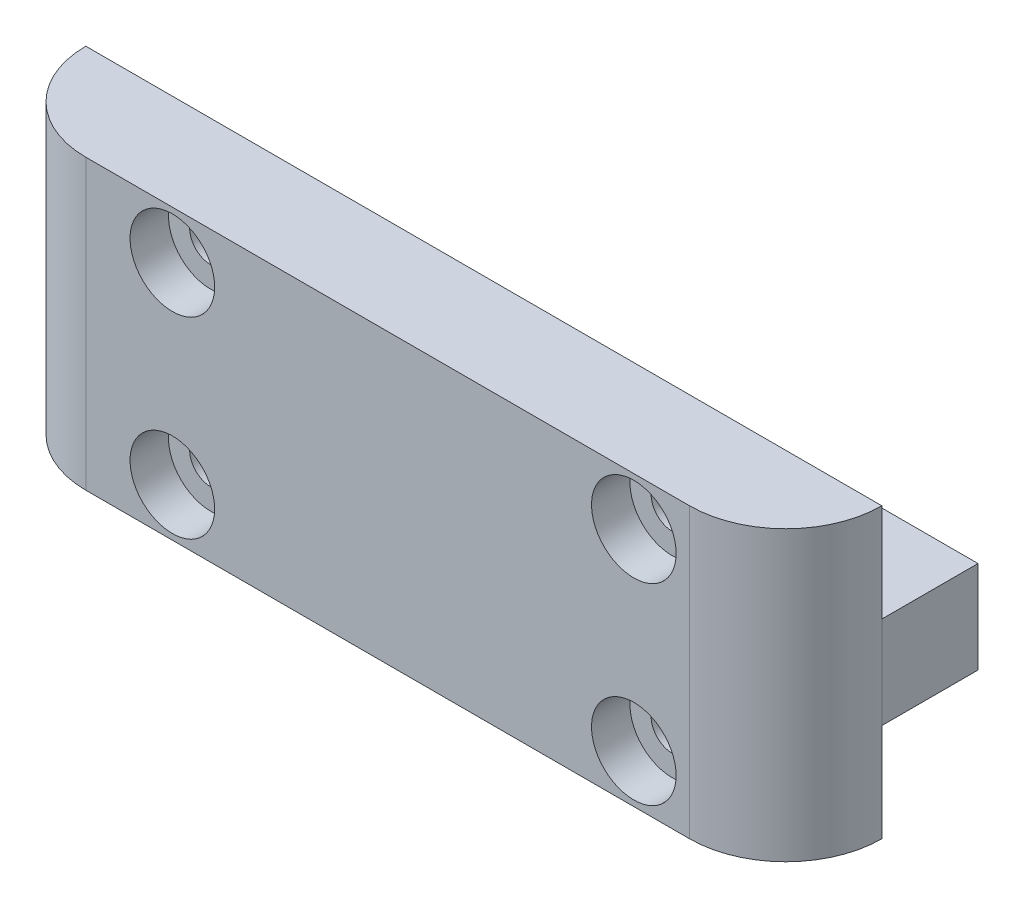
ISO-10303-21;
HEADER;
FILE_DESCRIPTION(('STEP AP214'),'2;1');
FILE_NAME('part.step','',(''),(''),'','','');
FILE_SCHEMA(('AUTOMOTIVE_DESIGN { 1 0 10303 214 1 1 1 1 }'));
ENDSEC;
DATA;
#1=APPLICATION_CONTEXT('core data for automotive mechanical design processes');
#2=APPLICATION_PROTOCOL_DEFINITION('international standard','automotive_design',2000,#1);
#3=PRODUCT_CONTEXT('',#1,'mechanical');
#4=PRODUCT('Part','Part','',(#3));
#5=PRODUCT_RELATED_PRODUCT_CATEGORY('part','',(#4));
#6=PRODUCT_DEFINITION_FORMATION('','',#4);
#7=PRODUCT_DEFINITION_CONTEXT('part definition',#1,'design');
#8=PRODUCT_DEFINITION('design','',#6,#7);
#9=PRODUCT_DEFINITION_SHAPE('','',#8);
#10=(LENGTH_UNIT() NAMED_UNIT(*) SI_UNIT(.MILLI.,.METRE.));
#11=(NAMED_UNIT(*) PLANE_ANGLE_UNIT() SI_UNIT($,.RADIAN.));
#12=(NAMED_UNIT(*) SI_UNIT($,.STERADIAN.) SOLID_ANGLE_UNIT());
#13=UNCERTAINTY_MEASURE_WITH_UNIT(LENGTH_MEASURE(1.E-05),#10,'distance_accuracy_value','');
#14=(GEOMETRIC_REPRESENTATION_CONTEXT(3) GLOBAL_UNCERTAINTY_ASSIGNED_CONTEXT((#13)) GLOBAL_UNIT_ASSIGNED_CONTEXT((#10,
#11,#12)) REPRESENTATION_CONTEXT('',''));
#15=CARTESIAN_POINT('',(0.,0.,0.));
#16=DIRECTION('',(0.,0.,1.));
#17=DIRECTION('',(1.,0.,0.));
#18=AXIS2_PLACEMENT_3D('',#15,#16,#17);
#19=CARTESIAN_POINT('',(20.7,-7.5,0.));
#20=DIRECTION('',(0.,0.,1.));
#21=DIRECTION('',(1.,0.,0.));
#22=AXIS2_PLACEMENT_3D('',#19,#20,#21);
#23=PLANE('',#22);
#24=CARTESIAN_POINT('',(12.8,5.,0.));
#25=DIRECTION('',(0.,0.,1.));
#26=DIRECTION('',(1.,0.,0.));
#27=AXIS2_PLACEMENT_3D('',#24,#25,#26);
#28=CIRCLE('',#27,1.1);
#29=CARTESIAN_POINT('',(13.9,5.,0.));
#30=VERTEX_POINT('',#29);
#31=EDGE_CURVE('E217',#30,#30,#28,.T.);
#32=ORIENTED_EDGE('',*,*,#31,.T.);
#33=EDGE_LOOP('',(#32));
#34=FACE_BOUND('',#33,.T.);
#35=CARTESIAN_POINT('',(-11.2,5.,0.));
#36=DIRECTION('',(0.,0.,1.));
#37=DIRECTION('',(1.,0.,0.));
#38=AXIS2_PLACEMENT_3D('',#35,#36,#37);
#39=CIRCLE('',#38,1.1);
#40=CARTESIAN_POINT('',(-10.1,5.,0.));
#41=VERTEX_POINT('',#40);
#42=EDGE_CURVE('E223',#41,#41,#39,.T.);
#43=ORIENTED_EDGE('',*,*,#42,.T.);
#44=EDGE_LOOP('',(#43));
#45=FACE_BOUND('',#44,.T.);
#46=DIRECTION('',(0.,1.,0.));
#47=VECTOR('',#46,1.);
#48=CARTESIAN_POINT('',(20.7,7.5,0.));
#49=LINE('',#48,#47);
#50=CARTESIAN_POINT('',(20.7,2.4,0.));
#51=VERTEX_POINT('',#50);
#52=CARTESIAN_POINT('',(20.7,7.5,0.));
#53=VERTEX_POINT('',#52);
#54=EDGE_CURVE('E225',#51,#53,#49,.T.);
#55=ORIENTED_EDGE('',*,*,#54,.F.);
#56=DIRECTION('',(-1.,0.,0.));
#57=VECTOR('',#56,1.);
#58=CARTESIAN_POINT('',(-20.7,2.4,0.));
#59=LINE('',#58,#57);
#60=CARTESIAN_POINT('',(-20.7,2.4,0.));
#61=VERTEX_POINT('',#60);
#62=EDGE_CURVE('E105',#51,#61,#59,.T.);
#63=ORIENTED_EDGE('',*,*,#62,.T.);
#64=DIRECTION('',(0.,-1.,0.));
#65=VECTOR('',#64,1.);
#66=CARTESIAN_POINT('',(-20.7,7.5,0.));
#67=LINE('',#66,#65);
#68=CARTESIAN_POINT('',(-20.7,7.5,0.));
#69=VERTEX_POINT('',#68);
#70=EDGE_CURVE('E238',#69,#61,#67,.T.);
#71=ORIENTED_EDGE('',*,*,#70,.F.);
#72=DIRECTION('',(-1.,0.,0.));
#73=VECTOR('',#72,1.);
#74=CARTESIAN_POINT('',(-20.7,7.5,0.));
#75=LINE('',#74,#73);
#76=EDGE_CURVE('E167',#53,#69,#75,.T.);
#77=ORIENTED_EDGE('',*,*,#76,.F.);
#78=EDGE_LOOP('',(#55,#63,#71,#77));
#79=FACE_BOUND('',#78,.T.);
#80=ADVANCED_FACE('F32',(#34,#45,#79),#23,.F.);
#81=CARTESIAN_POINT('',(20.7,-7.5,5.));
#82=DIRECTION('',(0.,0.,1.));
#83=DIRECTION('',(1.,0.,0.));
#84=AXIS2_PLACEMENT_3D('',#81,#82,#83);
#85=PLANE('',#84);
#86=CARTESIAN_POINT('',(-11.2,5.,5.));
#87=DIRECTION('',(0.,0.,1.));
#88=DIRECTION('',(1.,0.,0.));
#89=AXIS2_PLACEMENT_3D('',#86,#87,#88);
#90=CIRCLE('',#89,2.19999999999999);
#91=CARTESIAN_POINT('',(-9.00000000000001,5.,5.));
#92=VERTEX_POINT('',#91);
#93=EDGE_CURVE('E476',#92,#92,#90,.T.);
#94=ORIENTED_EDGE('',*,*,#93,.F.);
#95=EDGE_LOOP('',(#94));
#96=FACE_BOUND('',#95,.T.);
#97=CARTESIAN_POINT('',(12.8,5.,5.));
#98=DIRECTION('',(0.,0.,1.));
#99=DIRECTION('',(1.,0.,0.));
#100=AXIS2_PLACEMENT_3D('',#97,#98,#99);
#101=CIRCLE('',#100,2.19999999999999);
#102=CARTESIAN_POINT('',(15.,5.,5.));
#103=VERTEX_POINT('',#102);
#104=EDGE_CURVE('E467',#103,#103,#101,.T.);
#105=ORIENTED_EDGE('',*,*,#104,.F.);
#106=EDGE_LOOP('',(#105));
#107=FACE_BOUND('',#106,.T.);
#108=CARTESIAN_POINT('',(12.8,-5.,5.));
#109=DIRECTION('',(0.,0.,1.));
#110=DIRECTION('',(1.,0.,0.));
#111=AXIS2_PLACEMENT_3D('',#108,#109,#110);
#112=CIRCLE('',#111,2.19999999999999);
#113=CARTESIAN_POINT('',(15.,-5.,5.));
#114=VERTEX_POINT('',#113);
#115=EDGE_CURVE('E458',#114,#114,#112,.T.);
#116=ORIENTED_EDGE('',*,*,#115,.F.);
#117=EDGE_LOOP('',(#116));
#118=FACE_BOUND('',#117,.T.);
#119=CARTESIAN_POINT('',(-11.2,-5.,5.));
#120=DIRECTION('',(0.,0.,1.));
#121=DIRECTION('',(1.,0.,0.));
#122=AXIS2_PLACEMENT_3D('',#119,#120,#121);
#123=CIRCLE('',#122,2.19999999999999);
#124=CARTESIAN_POINT('',(-9.00000000000001,-5.,5.));
#125=VERTEX_POINT('',#124);
#126=EDGE_CURVE('E446',#125,#125,#123,.T.);
#127=ORIENTED_EDGE('',*,*,#126,.F.);
#128=EDGE_LOOP('',(#127));
#129=FACE_BOUND('',#128,.T.);
#130=DIRECTION('',(-1.,0.,0.));
#131=VECTOR('',#130,1.);
#132=CARTESIAN_POINT('',(-20.7,7.5,5.));
#133=LINE('',#132,#131);
#134=CARTESIAN_POINT('',(15.7,7.5,5.));
#135=VERTEX_POINT('',#134);
#136=CARTESIAN_POINT('',(-15.7,7.5,5.));
#137=VERTEX_POINT('',#136);
#138=EDGE_CURVE('E165',#135,#137,#133,.T.);
#139=ORIENTED_EDGE('',*,*,#138,.T.);
#140=DIRECTION('',(0.,-1.,0.));
#141=VECTOR('',#140,1.);
#142=CARTESIAN_POINT('',(-15.7,-7.5,5.));
#143=LINE('',#142,#141);
#144=CARTESIAN_POINT('',(-15.7,-7.5,5.));
#145=VERTEX_POINT('',#144);
#146=EDGE_CURVE('E149',#137,#145,#143,.T.);
#147=ORIENTED_EDGE('',*,*,#146,.T.);
#148=DIRECTION('',(1.,0.,0.));
#149=VECTOR('',#148,1.);
#150=CARTESIAN_POINT('',(-20.7,-7.5,5.));
#151=LINE('',#150,#149);
#152=CARTESIAN_POINT('',(15.7,-7.5,5.));
#153=VERTEX_POINT('',#152);
#154=EDGE_CURVE('E150',#145,#153,#151,.T.);
#155=ORIENTED_EDGE('',*,*,#154,.T.);
#156=DIRECTION('',(0.,1.,0.));
#157=VECTOR('',#156,1.);
#158=CARTESIAN_POINT('',(15.7,7.5,5.));
#159=LINE('',#158,#157);
#160=EDGE_CURVE('E146',#153,#135,#159,.T.);
#161=ORIENTED_EDGE('',*,*,#160,.T.);
#162=EDGE_LOOP('',(#139,#147,#155,#161));
#163=FACE_BOUND('',#162,.T.);
#164=ADVANCED_FACE('F171',(#96,#107,#118,#129,#163),#85,.T.);
#165=CARTESIAN_POINT('',(12.8,-5.,0.));
#166=DIRECTION('',(0.,0.,1.));
#167=DIRECTION('',(-1.,0.,0.));
#168=AXIS2_PLACEMENT_3D('',#165,#166,#167);
#169=CIRCLE('',#168,1.1);
#170=CARTESIAN_POINT('',(11.7,-5.,0.));
#171=VERTEX_POINT('',#170);
#172=EDGE_CURVE('E208',#171,#171,#169,.T.);
#173=ORIENTED_EDGE('',*,*,#172,.T.);
#174=EDGE_LOOP('',(#173));
#175=FACE_BOUND('',#174,.T.);
#176=CARTESIAN_POINT('',(-20.7,-2.4,0.));
#177=VERTEX_POINT('',#176);
#178=CARTESIAN_POINT('',(-20.7,-7.5,0.));
#179=VERTEX_POINT('',#178);
#180=EDGE_CURVE('E212',#177,#179,#67,.T.);
#181=ORIENTED_EDGE('',*,*,#180,.F.);
#182=DIRECTION('',(1.,0.,0.));
#183=VECTOR('',#182,1.);
#184=CARTESIAN_POINT('',(-20.7,-2.4,0.));
#185=LINE('',#184,#183);
#186=CARTESIAN_POINT('',(20.7,-2.4,0.));
#187=VERTEX_POINT('',#186);
#188=EDGE_CURVE('E125',#177,#187,#185,.T.);
#189=ORIENTED_EDGE('',*,*,#188,.T.);
#190=CARTESIAN_POINT('',(20.7,-7.5,0.));
#191=VERTEX_POINT('',#190);
#192=EDGE_CURVE('E235',#191,#187,#49,.T.);
#193=ORIENTED_EDGE('',*,*,#192,.F.);
#194=DIRECTION('',(1.,0.,0.));
#195=VECTOR('',#194,1.);
#196=CARTESIAN_POINT('',(-20.7,-7.5,0.));
#197=LINE('',#196,#195);
#198=EDGE_CURVE('E173',#179,#191,#197,.T.);
#199=ORIENTED_EDGE('',*,*,#198,.F.);
#200=EDGE_LOOP('',(#181,#189,#193,#199));
#201=FACE_BOUND('',#200,.T.);
#202=CARTESIAN_POINT('',(-11.2,-5.,0.));
#203=DIRECTION('',(0.,0.,1.));
#204=DIRECTION('',(-1.,0.,0.));
#205=AXIS2_PLACEMENT_3D('',#202,#203,#204);
#206=CIRCLE('',#205,1.1);
#207=CARTESIAN_POINT('',(-12.3,-5.,0.));
#208=VERTEX_POINT('',#207);
#209=EDGE_CURVE('E215',#208,#208,#206,.T.);
#210=ORIENTED_EDGE('',*,*,#209,.T.);
#211=EDGE_LOOP('',(#210));
#212=FACE_BOUND('',#211,.T.);
#213=ADVANCED_FACE('F191',(#175,#201,#212),#23,.F.);
#214=CARTESIAN_POINT('',(20.7,7.5,5.));
#215=DIRECTION('',(-1.,0.,0.));
#216=DIRECTION('',(0.,0.,1.));
#217=AXIS2_PLACEMENT_3D('',#214,#215,#216);
#218=PLANE('',#217);
#219=DIRECTION('',(0.,0.,1.));
#220=VECTOR('',#219,1.);
#221=CARTESIAN_POINT('',(20.7,2.4,-5.));
#222=LINE('',#221,#220);
#223=CARTESIAN_POINT('',(20.7,2.4,-5.));
#224=VERTEX_POINT('',#223);
#225=EDGE_CURVE('E99',#224,#51,#222,.T.);
#226=ORIENTED_EDGE('',*,*,#225,.T.);
#227=DIRECTION('',(0.,1.,0.));
#228=VECTOR('',#227,1.);
#229=CARTESIAN_POINT('',(20.7,-7.5,0.));
#230=LINE('',#229,#228);
#231=EDGE_CURVE('E11',#51,#187,#230,.F.);
#232=ORIENTED_EDGE('',*,*,#231,.T.);
#233=DIRECTION('',(0.,0.,1.));
#234=VECTOR('',#233,1.);
#235=CARTESIAN_POINT('',(20.7,-2.4,-5.));
#236=LINE('',#235,#234);
#237=CARTESIAN_POINT('',(20.7,-2.4,-5.));
#238=VERTEX_POINT('',#237);
#239=EDGE_CURVE('E124',#238,#187,#236,.T.);
#240=ORIENTED_EDGE('',*,*,#239,.F.);
#241=DIRECTION('',(0.,1.,0.));
#242=VECTOR('',#241,1.);
#243=CARTESIAN_POINT('',(20.7,2.4,-5.));
#244=LINE('',#243,#242);
#245=EDGE_CURVE('E117',#238,#224,#244,.T.);
#246=ORIENTED_EDGE('',*,*,#245,.T.);
#247=EDGE_LOOP('',(#226,#232,#240,#246));
#248=FACE_BOUND('',#247,.T.);
#249=ADVANCED_FACE('F122',(#248),#218,.F.);
#250=CARTESIAN_POINT('',(-20.7,7.5,5.));
#251=DIRECTION('',(0.,-1.,0.));
#252=DIRECTION('',(0.,0.,-1.));
#253=AXIS2_PLACEMENT_3D('',#250,#251,#252);
#254=PLANE('',#253);
#255=ORIENTED_EDGE('',*,*,#76,.T.);
#256=CARTESIAN_POINT('',(-15.7,7.5,0.));
#257=DIRECTION('',(0.,-1.,0.));
#258=DIRECTION('',(0.,0.,-1.));
#259=AXIS2_PLACEMENT_3D('',#256,#257,#258);
#260=CIRCLE('',#259,5.);
#261=EDGE_CURVE('E41',#69,#137,#260,.F.);
#262=ORIENTED_EDGE('',*,*,#261,.T.);
#263=ORIENTED_EDGE('',*,*,#138,.F.);
#264=CARTESIAN_POINT('',(15.7,7.5,0.));
#265=DIRECTION('',(0.,-1.,0.));
#266=DIRECTION('',(0.,0.,-1.));
#267=AXIS2_PLACEMENT_3D('',#264,#265,#266);
#268=CIRCLE('',#267,5.);
#269=EDGE_CURVE('E156',#135,#53,#268,.F.);
#270=ORIENTED_EDGE('',*,*,#269,.T.);
#271=EDGE_LOOP('',(#255,#262,#263,#270));
#272=FACE_BOUND('',#271,.T.);
#273=ADVANCED_FACE('F164',(#272),#254,.F.);
#274=CARTESIAN_POINT('',(-20.7,7.5,5.));
#275=DIRECTION('',(1.,0.,0.));
#276=DIRECTION('',(0.,0.,-1.));
#277=AXIS2_PLACEMENT_3D('',#274,#275,#276);
#278=PLANE('',#277);
#279=DIRECTION('',(0.,0.,1.));
#280=VECTOR('',#279,1.);
#281=CARTESIAN_POINT('',(-20.7,-2.4,-5.));
#282=LINE('',#281,#280);
#283=CARTESIAN_POINT('',(-20.7,-2.4,-5.));
#284=VERTEX_POINT('',#283);
#285=EDGE_CURVE('E219',#284,#177,#282,.T.);
#286=ORIENTED_EDGE('',*,*,#285,.T.);
#287=DIRECTION('',(0.,-1.,0.));
#288=VECTOR('',#287,1.);
#289=CARTESIAN_POINT('',(-20.7,7.5,0.));
#290=LINE('',#289,#288);
#291=EDGE_CURVE('E154',#177,#61,#290,.F.);
#292=ORIENTED_EDGE('',*,*,#291,.T.);
#293=DIRECTION('',(0.,0.,1.));
#294=VECTOR('',#293,1.);
#295=CARTESIAN_POINT('',(-20.7,2.4,-5.));
#296=LINE('',#295,#294);
#297=CARTESIAN_POINT('',(-20.7,2.4,-5.));
#298=VERTEX_POINT('',#297);
#299=EDGE_CURVE('E109',#298,#61,#296,.T.);
#300=ORIENTED_EDGE('',*,*,#299,.F.);
#301=DIRECTION('',(0.,-1.,0.));
#302=VECTOR('',#301,1.);
#303=CARTESIAN_POINT('',(-20.7,2.4,-5.));
#304=LINE('',#303,#302);
#305=EDGE_CURVE('E120',#298,#284,#304,.T.);
#306=ORIENTED_EDGE('',*,*,#305,.T.);
#307=EDGE_LOOP('',(#286,#292,#300,#306));
#308=FACE_BOUND('',#307,.T.);
#309=ADVANCED_FACE('F252',(#308),#278,.F.);
#310=CARTESIAN_POINT('',(-20.7,-7.5,5.));
#311=DIRECTION('',(0.,1.,0.));
#312=DIRECTION('',(0.,0.,1.));
#313=AXIS2_PLACEMENT_3D('',#310,#311,#312);
#314=PLANE('',#313);
#315=ORIENTED_EDGE('',*,*,#154,.F.);
#316=CARTESIAN_POINT('',(-15.7,-7.5,0.));
#317=DIRECTION('',(0.,1.,0.));
#318=DIRECTION('',(0.,0.,1.));
#319=AXIS2_PLACEMENT_3D('',#316,#317,#318);
#320=CIRCLE('',#319,5.);
#321=EDGE_CURVE('E56',#145,#179,#320,.F.);
#322=ORIENTED_EDGE('',*,*,#321,.T.);
#323=ORIENTED_EDGE('',*,*,#198,.T.);
#324=CARTESIAN_POINT('',(15.7,-7.5,0.));
#325=DIRECTION('',(0.,1.,0.));
#326=DIRECTION('',(0.,0.,1.));
#327=AXIS2_PLACEMENT_3D('',#324,#325,#326);
#328=CIRCLE('',#327,5.);
#329=EDGE_CURVE('E48',#191,#153,#328,.F.);
#330=ORIENTED_EDGE('',*,*,#329,.T.);
#331=EDGE_LOOP('',(#315,#322,#323,#330));
#332=FACE_BOUND('',#331,.T.);
#333=ADVANCED_FACE('F249',(#332),#314,.F.);
#334=CARTESIAN_POINT('',(-11.2,5.,5.));
#335=DIRECTION('',(0.,0.,-1.));
#336=DIRECTION('',(-1.,0.,0.));
#337=AXIS2_PLACEMENT_3D('',#334,#335,#336);
#338=CYLINDRICAL_SURFACE('',#337,1.1);
#339=CARTESIAN_POINT('',(-11.2,5.,3.));
#340=DIRECTION('',(0.,0.,1.));
#341=DIRECTION('',(1.,0.,0.));
#342=AXIS2_PLACEMENT_3D('',#339,#340,#341);
#343=CIRCLE('',#342,1.1);
#344=CARTESIAN_POINT('',(-10.1,5.,3.));
#345=VERTEX_POINT('',#344);
#346=EDGE_CURVE('E470',#345,#345,#343,.T.);
#347=ORIENTED_EDGE('',*,*,#346,.T.);
#348=EDGE_LOOP('',(#347));
#349=FACE_BOUND('',#348,.T.);
#350=ORIENTED_EDGE('',*,*,#42,.F.);
#351=EDGE_LOOP('',(#350));
#352=FACE_BOUND('',#351,.T.);
#353=ADVANCED_FACE('F251',(#349,#352),#338,.F.);
#354=CARTESIAN_POINT('',(12.8,5.,5.));
#355=DIRECTION('',(0.,0.,-1.));
#356=DIRECTION('',(-1.,0.,0.));
#357=AXIS2_PLACEMENT_3D('',#354,#355,#356);
#358=CYLINDRICAL_SURFACE('',#357,1.1);
#359=CARTESIAN_POINT('',(12.8,5.,3.));
#360=DIRECTION('',(0.,0.,1.));
#361=DIRECTION('',(1.,0.,0.));
#362=AXIS2_PLACEMENT_3D('',#359,#360,#361);
#363=CIRCLE('',#362,1.1);
#364=CARTESIAN_POINT('',(13.9,5.,3.));
#365=VERTEX_POINT('',#364);
#366=EDGE_CURVE('E461',#365,#365,#363,.T.);
#367=ORIENTED_EDGE('',*,*,#366,.T.);
#368=EDGE_LOOP('',(#367));
#369=FACE_BOUND('',#368,.T.);
#370=ORIENTED_EDGE('',*,*,#31,.F.);
#371=EDGE_LOOP('',(#370));
#372=FACE_BOUND('',#371,.T.);
#373=ADVANCED_FACE('F257',(#369,#372),#358,.F.);
#374=CARTESIAN_POINT('',(12.8,-5.,5.));
#375=DIRECTION('',(0.,0.,-1.));
#376=DIRECTION('',(-1.,0.,0.));
#377=AXIS2_PLACEMENT_3D('',#374,#375,#376);
#378=CYLINDRICAL_SURFACE('',#377,1.1);
#379=CARTESIAN_POINT('',(12.8,-5.,3.));
#380=DIRECTION('',(0.,0.,1.));
#381=DIRECTION('',(1.,0.,0.));
#382=AXIS2_PLACEMENT_3D('',#379,#380,#381);
#383=CIRCLE('',#382,1.1);
#384=CARTESIAN_POINT('',(13.9,-5.,3.));
#385=VERTEX_POINT('',#384);
#386=EDGE_CURVE('E450',#385,#385,#383,.T.);
#387=ORIENTED_EDGE('',*,*,#386,.T.);
#388=EDGE_LOOP('',(#387));
#389=FACE_BOUND('',#388,.T.);
#390=ORIENTED_EDGE('',*,*,#172,.F.);
#391=EDGE_LOOP('',(#390));
#392=FACE_BOUND('',#391,.T.);
#393=ADVANCED_FACE('F397',(#389,#392),#378,.F.);
#394=CARTESIAN_POINT('',(-11.2,-5.,5.));
#395=DIRECTION('',(0.,0.,-1.));
#396=DIRECTION('',(-1.,0.,0.));
#397=AXIS2_PLACEMENT_3D('',#394,#395,#396);
#398=CYLINDRICAL_SURFACE('',#397,1.1);
#399=CARTESIAN_POINT('',(-11.2,-5.,3.));
#400=DIRECTION('',(0.,0.,1.));
#401=DIRECTION('',(1.,0.,0.));
#402=AXIS2_PLACEMENT_3D('',#399,#400,#401);
#403=CIRCLE('',#402,1.1);
#404=CARTESIAN_POINT('',(-10.1,-5.,3.));
#405=VERTEX_POINT('',#404);
#406=EDGE_CURVE('E130',#405,#405,#403,.T.);
#407=ORIENTED_EDGE('',*,*,#406,.T.);
#408=EDGE_LOOP('',(#407));
#409=FACE_BOUND('',#408,.T.);
#410=ORIENTED_EDGE('',*,*,#209,.F.);
#411=EDGE_LOOP('',(#410));
#412=FACE_BOUND('',#411,.T.);
#413=ADVANCED_FACE('F288',(#409,#412),#398,.F.);
#414=CARTESIAN_POINT('',(-20.7,-2.4,-5.));
#415=DIRECTION('',(0.,-1.,0.));
#416=DIRECTION('',(0.,0.,-1.));
#417=AXIS2_PLACEMENT_3D('',#414,#415,#416);
#418=PLANE('',#417);
#419=ORIENTED_EDGE('',*,*,#188,.F.);
#420=ORIENTED_EDGE('',*,*,#285,.F.);
#421=DIRECTION('',(1.,0.,0.));
#422=VECTOR('',#421,1.);
#423=CARTESIAN_POINT('',(-20.7,-2.4,-5.));
#424=LINE('',#423,#422);
#425=EDGE_CURVE('E110',#284,#238,#424,.T.);
#426=ORIENTED_EDGE('',*,*,#425,.T.);
#427=ORIENTED_EDGE('',*,*,#239,.T.);
#428=EDGE_LOOP('',(#419,#420,#426,#427));
#429=FACE_BOUND('',#428,.T.);
#430=ADVANCED_FACE('F248',(#429),#418,.T.);
#431=CARTESIAN_POINT('',(-20.7,2.4,-5.));
#432=DIRECTION('',(0.,1.,0.));
#433=DIRECTION('',(0.,0.,1.));
#434=AXIS2_PLACEMENT_3D('',#431,#432,#433);
#435=PLANE('',#434);
#436=ORIENTED_EDGE('',*,*,#62,.F.);
#437=ORIENTED_EDGE('',*,*,#225,.F.);
#438=DIRECTION('',(-1.,0.,0.));
#439=VECTOR('',#438,1.);
#440=CARTESIAN_POINT('',(-20.7,2.4,-5.));
#441=LINE('',#440,#439);
#442=EDGE_CURVE('E103',#224,#298,#441,.T.);
#443=ORIENTED_EDGE('',*,*,#442,.T.);
#444=ORIENTED_EDGE('',*,*,#299,.T.);
#445=EDGE_LOOP('',(#436,#437,#443,#444));
#446=FACE_BOUND('',#445,.T.);
#447=ADVANCED_FACE('F101',(#446),#435,.T.);
#448=CARTESIAN_POINT('',(20.7,-2.4,-5.));
#449=DIRECTION('',(0.,0.,1.));
#450=DIRECTION('',(1.,0.,0.));
#451=AXIS2_PLACEMENT_3D('',#448,#449,#450);
#452=PLANE('',#451);
#453=ORIENTED_EDGE('',*,*,#245,.F.);
#454=ORIENTED_EDGE('',*,*,#425,.F.);
#455=ORIENTED_EDGE('',*,*,#305,.F.);
#456=ORIENTED_EDGE('',*,*,#442,.F.);
#457=EDGE_LOOP('',(#453,#454,#455,#456));
#458=FACE_BOUND('',#457,.T.);
#459=ADVANCED_FACE('F115',(#458),#452,.F.);
#460=CARTESIAN_POINT('',(-10.1,-5.,3.));
#461=DIRECTION('',(0.,0.,-1.));
#462=DIRECTION('',(-1.,0.,0.));
#463=AXIS2_PLACEMENT_3D('',#460,#461,#462);
#464=PLANE('',#463);
#465=ORIENTED_EDGE('',*,*,#406,.F.);
#466=EDGE_LOOP('',(#465));
#467=FACE_BOUND('',#466,.T.);
#468=CARTESIAN_POINT('',(-11.2,-5.,3.));
#469=DIRECTION('',(0.,0.,1.));
#470=DIRECTION('',(1.,0.,0.));
#471=AXIS2_PLACEMENT_3D('',#468,#469,#470);
#472=CIRCLE('',#471,2.2);
#473=CARTESIAN_POINT('',(-9.00000000000001,-5.,3.));
#474=VERTEX_POINT('',#473);
#475=EDGE_CURVE('E444',#474,#474,#472,.T.);
#476=ORIENTED_EDGE('',*,*,#475,.T.);
#477=EDGE_LOOP('',(#476));
#478=FACE_BOUND('',#477,.T.);
#479=ADVANCED_FACE('F369',(#467,#478),#464,.F.);
#480=CARTESIAN_POINT('',(-11.2,-5.,5.));
#481=DIRECTION('',(0.,0.,1.));
#482=DIRECTION('',(1.,0.,0.));
#483=AXIS2_PLACEMENT_3D('',#480,#481,#482);
#484=CYLINDRICAL_SURFACE('',#483,2.19999999999999);
#485=ORIENTED_EDGE('',*,*,#475,.F.);
#486=EDGE_LOOP('',(#485));
#487=FACE_BOUND('',#486,.T.);
#488=ORIENTED_EDGE('',*,*,#126,.T.);
#489=EDGE_LOOP('',(#488));
#490=FACE_BOUND('',#489,.T.);
#491=ADVANCED_FACE('F360',(#487,#490),#484,.F.);
#492=CARTESIAN_POINT('',(13.9,-5.,3.));
#493=DIRECTION('',(0.,0.,-1.));
#494=DIRECTION('',(-1.,0.,0.));
#495=AXIS2_PLACEMENT_3D('',#492,#493,#494);
#496=PLANE('',#495);
#497=ORIENTED_EDGE('',*,*,#386,.F.);
#498=EDGE_LOOP('',(#497));
#499=FACE_BOUND('',#498,.T.);
#500=CARTESIAN_POINT('',(12.8,-5.,3.));
#501=DIRECTION('',(0.,0.,1.));
#502=DIRECTION('',(1.,0.,0.));
#503=AXIS2_PLACEMENT_3D('',#500,#501,#502);
#504=CIRCLE('',#503,2.2);
#505=CARTESIAN_POINT('',(15.,-5.,3.));
#506=VERTEX_POINT('',#505);
#507=EDGE_CURVE('E455',#506,#506,#504,.T.);
#508=ORIENTED_EDGE('',*,*,#507,.T.);
#509=EDGE_LOOP('',(#508));
#510=FACE_BOUND('',#509,.T.);
#511=ADVANCED_FACE('F351',(#499,#510),#496,.F.);
#512=CARTESIAN_POINT('',(12.8,-5.,5.));
#513=DIRECTION('',(0.,0.,1.));
#514=DIRECTION('',(1.,0.,0.));
#515=AXIS2_PLACEMENT_3D('',#512,#513,#514);
#516=CYLINDRICAL_SURFACE('',#515,2.19999999999999);
#517=ORIENTED_EDGE('',*,*,#507,.F.);
#518=EDGE_LOOP('',(#517));
#519=FACE_BOUND('',#518,.T.);
#520=ORIENTED_EDGE('',*,*,#115,.T.);
#521=EDGE_LOOP('',(#520));
#522=FACE_BOUND('',#521,.T.);
#523=ADVANCED_FACE('F342',(#519,#522),#516,.F.);
#524=CARTESIAN_POINT('',(13.9,5.,3.));
#525=DIRECTION('',(0.,0.,-1.));
#526=DIRECTION('',(-1.,0.,0.));
#527=AXIS2_PLACEMENT_3D('',#524,#525,#526);
#528=PLANE('',#527);
#529=ORIENTED_EDGE('',*,*,#366,.F.);
#530=EDGE_LOOP('',(#529));
#531=FACE_BOUND('',#530,.T.);
#532=CARTESIAN_POINT('',(12.8,5.,3.));
#533=DIRECTION('',(0.,0.,1.));
#534=DIRECTION('',(1.,0.,0.));
#535=AXIS2_PLACEMENT_3D('',#532,#533,#534);
#536=CIRCLE('',#535,2.2);
#537=CARTESIAN_POINT('',(15.,5.,3.));
#538=VERTEX_POINT('',#537);
#539=EDGE_CURVE('E464',#538,#538,#536,.T.);
#540=ORIENTED_EDGE('',*,*,#539,.T.);
#541=EDGE_LOOP('',(#540));
#542=FACE_BOUND('',#541,.T.);
#543=ADVANCED_FACE('F333',(#531,#542),#528,.F.);
#544=CARTESIAN_POINT('',(12.8,5.,5.));
#545=DIRECTION('',(0.,0.,1.));
#546=DIRECTION('',(1.,0.,0.));
#547=AXIS2_PLACEMENT_3D('',#544,#545,#546);
#548=CYLINDRICAL_SURFACE('',#547,2.19999999999999);
#549=ORIENTED_EDGE('',*,*,#539,.F.);
#550=EDGE_LOOP('',(#549));
#551=FACE_BOUND('',#550,.T.);
#552=ORIENTED_EDGE('',*,*,#104,.T.);
#553=EDGE_LOOP('',(#552));
#554=FACE_BOUND('',#553,.T.);
#555=ADVANCED_FACE('F324',(#551,#554),#548,.F.);
#556=CARTESIAN_POINT('',(-10.1,5.,3.));
#557=DIRECTION('',(0.,0.,-1.));
#558=DIRECTION('',(-1.,0.,0.));
#559=AXIS2_PLACEMENT_3D('',#556,#557,#558);
#560=PLANE('',#559);
#561=ORIENTED_EDGE('',*,*,#346,.F.);
#562=EDGE_LOOP('',(#561));
#563=FACE_BOUND('',#562,.T.);
#564=CARTESIAN_POINT('',(-11.2,5.,3.));
#565=DIRECTION('',(0.,0.,1.));
#566=DIRECTION('',(1.,0.,0.));
#567=AXIS2_PLACEMENT_3D('',#564,#565,#566);
#568=CIRCLE('',#567,2.2);
#569=CARTESIAN_POINT('',(-9.00000000000001,5.,3.));
#570=VERTEX_POINT('',#569);
#571=EDGE_CURVE('E473',#570,#570,#568,.T.);
#572=ORIENTED_EDGE('',*,*,#571,.T.);
#573=EDGE_LOOP('',(#572));
#574=FACE_BOUND('',#573,.T.);
#575=ADVANCED_FACE('F184',(#563,#574),#560,.F.);
#576=CARTESIAN_POINT('',(-11.2,5.,5.));
#577=DIRECTION('',(0.,0.,1.));
#578=DIRECTION('',(1.,0.,0.));
#579=AXIS2_PLACEMENT_3D('',#576,#577,#578);
#580=CYLINDRICAL_SURFACE('',#579,2.19999999999999);
#581=ORIENTED_EDGE('',*,*,#571,.F.);
#582=EDGE_LOOP('',(#581));
#583=FACE_BOUND('',#582,.T.);
#584=ORIENTED_EDGE('',*,*,#93,.T.);
#585=EDGE_LOOP('',(#584));
#586=FACE_BOUND('',#585,.T.);
#587=ADVANCED_FACE('F178',(#583,#586),#580,.F.);
#588=CARTESIAN_POINT('',(-15.7,-7.5,0.));
#589=DIRECTION('',(0.,1.,0.));
#590=DIRECTION('',(0.,0.,1.));
#591=AXIS2_PLACEMENT_3D('',#588,#589,#590);
#592=CYLINDRICAL_SURFACE('',#591,5.);
#593=ORIENTED_EDGE('',*,*,#291,.F.);
#594=ORIENTED_EDGE('',*,*,#180,.T.);
#595=ORIENTED_EDGE('',*,*,#321,.F.);
#596=ORIENTED_EDGE('',*,*,#146,.F.);
#597=ORIENTED_EDGE('',*,*,#261,.F.);
#598=ORIENTED_EDGE('',*,*,#70,.T.);
#599=EDGE_LOOP('',(#593,#594,#595,#596,#597,#598));
#600=FACE_BOUND('',#599,.T.);
#601=ADVANCED_FACE('F176',(#600),#592,.T.);
#602=CARTESIAN_POINT('',(15.7,-7.5,0.));
#603=DIRECTION('',(0.,-1.,0.));
#604=DIRECTION('',(0.,0.,-1.));
#605=AXIS2_PLACEMENT_3D('',#602,#603,#604);
#606=CYLINDRICAL_SURFACE('',#605,5.);
#607=ORIENTED_EDGE('',*,*,#231,.F.);
#608=ORIENTED_EDGE('',*,*,#54,.T.);
#609=ORIENTED_EDGE('',*,*,#269,.F.);
#610=ORIENTED_EDGE('',*,*,#160,.F.);
#611=ORIENTED_EDGE('',*,*,#329,.F.);
#612=ORIENTED_EDGE('',*,*,#192,.T.);
#613=EDGE_LOOP('',(#607,#608,#609,#610,#611,#612));
#614=FACE_BOUND('',#613,.T.);
#615=ADVANCED_FACE('F34',(#614),#606,.T.);
#616=CLOSED_SHELL('',(#80,#164,#213,#249,#273,#309,#333,#353,#373,#393,#413,#430,#447,#459,#479,
#491,#511,#523,#543,#555,#575,#587,#601,#615));
#617=MANIFOLD_SOLID_BREP('B2',#616);
#618=ADVANCED_BREP_SHAPE_REPRESENTATION('',(#18,#617),#14);
#619=SHAPE_DEFINITION_REPRESENTATION(#9,#618);
ENDSEC;
END-ISO-10303-21;
